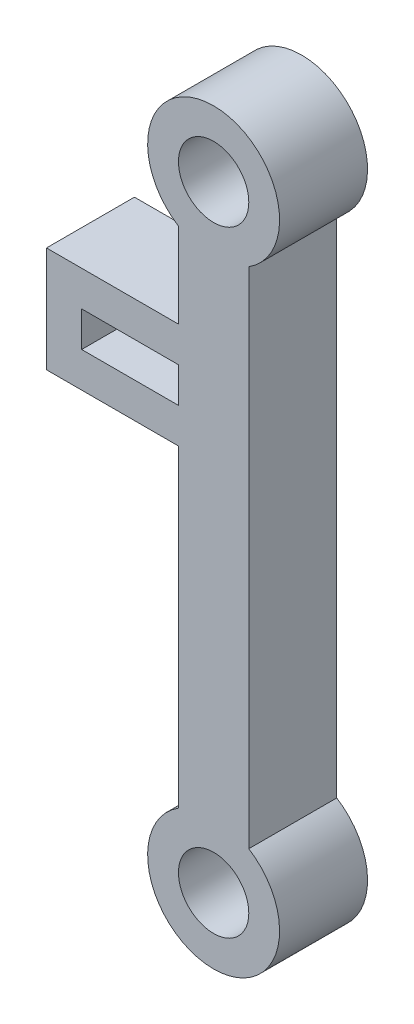
ISO-10303-21;
HEADER;
FILE_DESCRIPTION(('STEP AP214'),'2;1');
FILE_NAME('part.step','',(''),(''),'','','');
FILE_SCHEMA(('AUTOMOTIVE_DESIGN { 1 0 10303 214 1 1 1 1 }'));
ENDSEC;
DATA;
#1=APPLICATION_CONTEXT('core data for automotive mechanical design processes');
#2=APPLICATION_PROTOCOL_DEFINITION('international standard','automotive_design',2000,#1);
#3=PRODUCT_CONTEXT('',#1,'mechanical');
#4=PRODUCT('Part','Part','',(#3));
#5=PRODUCT_RELATED_PRODUCT_CATEGORY('part','',(#4));
#6=PRODUCT_DEFINITION_FORMATION('','',#4);
#7=PRODUCT_DEFINITION_CONTEXT('part definition',#1,'design');
#8=PRODUCT_DEFINITION('design','',#6,#7);
#9=PRODUCT_DEFINITION_SHAPE('','',#8);
#10=(LENGTH_UNIT() NAMED_UNIT(*) SI_UNIT(.MILLI.,.METRE.));
#11=(NAMED_UNIT(*) PLANE_ANGLE_UNIT() SI_UNIT($,.RADIAN.));
#12=(NAMED_UNIT(*) SI_UNIT($,.STERADIAN.) SOLID_ANGLE_UNIT());
#13=UNCERTAINTY_MEASURE_WITH_UNIT(LENGTH_MEASURE(1.E-05),#10,'distance_accuracy_value','');
#14=(GEOMETRIC_REPRESENTATION_CONTEXT(3) GLOBAL_UNCERTAINTY_ASSIGNED_CONTEXT((#13)) GLOBAL_UNIT_ASSIGNED_CONTEXT((#10,
#11,#12)) REPRESENTATION_CONTEXT('',''));
#15=CARTESIAN_POINT('',(0.,0.,0.));
#16=DIRECTION('',(0.,0.,1.));
#17=DIRECTION('',(1.,0.,0.));
#18=AXIS2_PLACEMENT_3D('',#15,#16,#17);
#19=CARTESIAN_POINT('',(0.,70.,10.));
#20=DIRECTION('',(0.,0.,1.));
#21=DIRECTION('',(1.,0.,0.));
#22=AXIS2_PLACEMENT_3D('',#19,#20,#21);
#23=PLANE('',#22);
#24=CARTESIAN_POINT('',(0.,70.,10.));
#25=DIRECTION('',(0.,0.,1.));
#26=DIRECTION('',(1.,0.,0.));
#27=AXIS2_PLACEMENT_3D('',#24,#25,#26);
#28=CIRCLE('',#27,4.00000000000001);
#29=CARTESIAN_POINT('',(4.00000000000001,70.,10.));
#30=VERTEX_POINT('',#29);
#31=EDGE_CURVE('E164',#30,#30,#28,.T.);
#32=ORIENTED_EDGE('',*,*,#31,.F.);
#33=EDGE_LOOP('',(#32));
#34=FACE_BOUND('',#33,.T.);
#35=CARTESIAN_POINT('',(0.,70.,10.));
#36=DIRECTION('',(0.,0.,1.));
#37=DIRECTION('',(1.,0.,0.));
#38=AXIS2_PLACEMENT_3D('',#35,#36,#37);
#39=CIRCLE('',#38,7.5);
#40=CARTESIAN_POINT('',(4.,63.6557112297752,10.));
#41=VERTEX_POINT('',#40);
#42=CARTESIAN_POINT('',(-4.,63.6557112297752,10.));
#43=VERTEX_POINT('',#42);
#44=EDGE_CURVE('E170',#41,#43,#39,.T.);
#45=ORIENTED_EDGE('',*,*,#44,.T.);
#46=DIRECTION('',(0.,-1.,0.));
#47=VECTOR('',#46,1.);
#48=CARTESIAN_POINT('',(-4.,63.6557112297752,10.));
#49=LINE('',#48,#47);
#50=CARTESIAN_POINT('',(-4.,54.,10.));
#51=VERTEX_POINT('',#50);
#52=EDGE_CURVE('E173',#43,#51,#49,.T.);
#53=ORIENTED_EDGE('',*,*,#52,.T.);
#54=DIRECTION('',(-1.,0.,0.));
#55=VECTOR('',#54,1.);
#56=CARTESIAN_POINT('',(-19.,54.,10.));
#57=LINE('',#56,#55);
#58=CARTESIAN_POINT('',(-19.,54.,10.));
#59=VERTEX_POINT('',#58);
#60=EDGE_CURVE('E176',#51,#59,#57,.T.);
#61=ORIENTED_EDGE('',*,*,#60,.T.);
#62=DIRECTION('',(0.,-1.,0.));
#63=VECTOR('',#62,1.);
#64=CARTESIAN_POINT('',(-19.,42.,10.));
#65=LINE('',#64,#63);
#66=CARTESIAN_POINT('',(-19.,42.,10.));
#67=VERTEX_POINT('',#66);
#68=EDGE_CURVE('E178',#59,#67,#65,.T.);
#69=ORIENTED_EDGE('',*,*,#68,.T.);
#70=DIRECTION('',(1.,0.,0.));
#71=VECTOR('',#70,1.);
#72=CARTESIAN_POINT('',(-4.,42.,10.));
#73=LINE('',#72,#71);
#74=CARTESIAN_POINT('',(-4.,42.,10.));
#75=VERTEX_POINT('',#74);
#76=EDGE_CURVE('E180',#67,#75,#73,.T.);
#77=ORIENTED_EDGE('',*,*,#76,.T.);
#78=DIRECTION('',(0.,-1.,0.));
#79=VECTOR('',#78,1.);
#80=CARTESIAN_POINT('',(-4.,42.,10.));
#81=LINE('',#80,#79);
#82=CARTESIAN_POINT('',(-3.99999999999999,6.34428877022475,10.));
#83=VERTEX_POINT('',#82);
#84=EDGE_CURVE('E182',#75,#83,#81,.T.);
#85=ORIENTED_EDGE('',*,*,#84,.T.);
#86=CARTESIAN_POINT('',(0.,0.,10.));
#87=DIRECTION('',(0.,0.,1.));
#88=DIRECTION('',(1.,0.,0.));
#89=AXIS2_PLACEMENT_3D('',#86,#87,#88);
#90=CIRCLE('',#89,7.49999999999999);
#91=CARTESIAN_POINT('',(4.00000000000001,6.34428877022475,10.));
#92=VERTEX_POINT('',#91);
#93=EDGE_CURVE('E184',#83,#92,#90,.T.);
#94=ORIENTED_EDGE('',*,*,#93,.T.);
#95=DIRECTION('',(0.,1.,0.));
#96=VECTOR('',#95,1.);
#97=CARTESIAN_POINT('',(4.,63.6557112297752,10.));
#98=LINE('',#97,#96);
#99=EDGE_CURVE('E186',#92,#41,#98,.T.);
#100=ORIENTED_EDGE('',*,*,#99,.T.);
#101=EDGE_LOOP('',(#45,#53,#61,#69,#77,#85,#94,#100));
#102=FACE_BOUND('',#101,.T.);
#103=CARTESIAN_POINT('',(0.,0.,10.));
#104=DIRECTION('',(0.,0.,1.));
#105=DIRECTION('',(1.,0.,0.));
#106=AXIS2_PLACEMENT_3D('',#103,#104,#105);
#107=CIRCLE('',#106,4.);
#108=CARTESIAN_POINT('',(4.,0.,10.));
#109=VERTEX_POINT('',#108);
#110=EDGE_CURVE('E158',#109,#109,#107,.T.);
#111=ORIENTED_EDGE('',*,*,#110,.F.);
#112=EDGE_LOOP('',(#111));
#113=FACE_BOUND('',#112,.T.);
#114=DIRECTION('',(-1.,0.,0.));
#115=VECTOR('',#114,1.);
#116=CARTESIAN_POINT('',(-15.,50.,10.));
#117=LINE('',#116,#115);
#118=CARTESIAN_POINT('',(-4.00000000000001,50.,10.));
#119=VERTEX_POINT('',#118);
#120=CARTESIAN_POINT('',(-15.,50.,10.));
#121=VERTEX_POINT('',#120);
#122=EDGE_CURVE('E130',#119,#121,#117,.T.);
#123=ORIENTED_EDGE('',*,*,#122,.F.);
#124=DIRECTION('',(0.,1.,0.));
#125=VECTOR('',#124,1.);
#126=CARTESIAN_POINT('',(-4.00000000000001,50.,10.));
#127=LINE('',#126,#125);
#128=CARTESIAN_POINT('',(-4.00000000000001,46.,10.));
#129=VERTEX_POINT('',#128);
#130=EDGE_CURVE('E122',#129,#119,#127,.T.);
#131=ORIENTED_EDGE('',*,*,#130,.F.);
#132=DIRECTION('',(1.,0.,0.));
#133=VECTOR('',#132,1.);
#134=CARTESIAN_POINT('',(-15.,46.,10.));
#135=LINE('',#134,#133);
#136=CARTESIAN_POINT('',(-15.,46.,10.));
#137=VERTEX_POINT('',#136);
#138=EDGE_CURVE('E144',#137,#129,#135,.T.);
#139=ORIENTED_EDGE('',*,*,#138,.F.);
#140=DIRECTION('',(0.,-1.,0.));
#141=VECTOR('',#140,1.);
#142=CARTESIAN_POINT('',(-15.,50.,10.));
#143=LINE('',#142,#141);
#144=EDGE_CURVE('E142',#121,#137,#143,.T.);
#145=ORIENTED_EDGE('',*,*,#144,.F.);
#146=EDGE_LOOP('',(#123,#131,#139,#145));
#147=FACE_BOUND('',#146,.T.);
#148=ADVANCED_FACE('F33',(#34,#102,#113,#147),#23,.T.);
#149=CARTESIAN_POINT('',(0.,70.,0.));
#150=DIRECTION('',(0.,0.,1.));
#151=DIRECTION('',(1.,0.,0.));
#152=AXIS2_PLACEMENT_3D('',#149,#150,#151);
#153=PLANE('',#152);
#154=CARTESIAN_POINT('',(0.,0.,0.));
#155=DIRECTION('',(0.,0.,1.));
#156=DIRECTION('',(1.,0.,0.));
#157=AXIS2_PLACEMENT_3D('',#154,#155,#156);
#158=CIRCLE('',#157,4.);
#159=CARTESIAN_POINT('',(4.,0.,0.));
#160=VERTEX_POINT('',#159);
#161=EDGE_CURVE('E138',#160,#160,#158,.T.);
#162=ORIENTED_EDGE('',*,*,#161,.T.);
#163=EDGE_LOOP('',(#162));
#164=FACE_BOUND('',#163,.T.);
#165=CARTESIAN_POINT('',(0.,70.,0.));
#166=DIRECTION('',(0.,0.,1.));
#167=DIRECTION('',(1.,0.,0.));
#168=AXIS2_PLACEMENT_3D('',#165,#166,#167);
#169=CIRCLE('',#168,4.00000000000001);
#170=CARTESIAN_POINT('',(4.00000000000001,70.,0.));
#171=VERTEX_POINT('',#170);
#172=EDGE_CURVE('E161',#171,#171,#169,.T.);
#173=ORIENTED_EDGE('',*,*,#172,.T.);
#174=EDGE_LOOP('',(#173));
#175=FACE_BOUND('',#174,.T.);
#176=CARTESIAN_POINT('',(0.,70.,0.));
#177=DIRECTION('',(0.,0.,1.));
#178=DIRECTION('',(1.,0.,0.));
#179=AXIS2_PLACEMENT_3D('',#176,#177,#178);
#180=CIRCLE('',#179,7.5);
#181=CARTESIAN_POINT('',(4.,63.6557112297752,0.));
#182=VERTEX_POINT('',#181);
#183=CARTESIAN_POINT('',(-4.,63.6557112297752,0.));
#184=VERTEX_POINT('',#183);
#185=EDGE_CURVE('E167',#182,#184,#180,.T.);
#186=ORIENTED_EDGE('',*,*,#185,.F.);
#187=DIRECTION('',(0.,1.,0.));
#188=VECTOR('',#187,1.);
#189=CARTESIAN_POINT('',(4.,63.6557112297752,0.));
#190=LINE('',#189,#188);
#191=CARTESIAN_POINT('',(4.00000000000001,6.34428877022475,0.));
#192=VERTEX_POINT('',#191);
#193=EDGE_CURVE('E174',#192,#182,#190,.T.);
#194=ORIENTED_EDGE('',*,*,#193,.F.);
#195=CARTESIAN_POINT('',(0.,0.,0.));
#196=DIRECTION('',(0.,0.,1.));
#197=DIRECTION('',(1.,0.,0.));
#198=AXIS2_PLACEMENT_3D('',#195,#196,#197);
#199=CIRCLE('',#198,7.49999999999999);
#200=CARTESIAN_POINT('',(-3.99999999999999,6.34428877022475,0.));
#201=VERTEX_POINT('',#200);
#202=EDGE_CURVE('E201',#201,#192,#199,.T.);
#203=ORIENTED_EDGE('',*,*,#202,.F.);
#204=DIRECTION('',(0.,-1.,0.));
#205=VECTOR('',#204,1.);
#206=CARTESIAN_POINT('',(-4.,42.,0.));
#207=LINE('',#206,#205);
#208=CARTESIAN_POINT('',(-4.,42.,0.));
#209=VERTEX_POINT('',#208);
#210=EDGE_CURVE('E199',#209,#201,#207,.T.);
#211=ORIENTED_EDGE('',*,*,#210,.F.);
#212=DIRECTION('',(1.,0.,0.));
#213=VECTOR('',#212,1.);
#214=CARTESIAN_POINT('',(-4.,42.,0.));
#215=LINE('',#214,#213);
#216=CARTESIAN_POINT('',(-19.,42.,0.));
#217=VERTEX_POINT('',#216);
#218=EDGE_CURVE('E197',#217,#209,#215,.T.);
#219=ORIENTED_EDGE('',*,*,#218,.F.);
#220=DIRECTION('',(0.,-1.,0.));
#221=VECTOR('',#220,1.);
#222=CARTESIAN_POINT('',(-19.,42.,0.));
#223=LINE('',#222,#221);
#224=CARTESIAN_POINT('',(-19.,54.,0.));
#225=VERTEX_POINT('',#224);
#226=EDGE_CURVE('E195',#225,#217,#223,.T.);
#227=ORIENTED_EDGE('',*,*,#226,.F.);
#228=DIRECTION('',(-1.,0.,0.));
#229=VECTOR('',#228,1.);
#230=CARTESIAN_POINT('',(-19.,54.,0.));
#231=LINE('',#230,#229);
#232=CARTESIAN_POINT('',(-4.,54.,0.));
#233=VERTEX_POINT('',#232);
#234=EDGE_CURVE('E193',#233,#225,#231,.T.);
#235=ORIENTED_EDGE('',*,*,#234,.F.);
#236=DIRECTION('',(0.,-1.,0.));
#237=VECTOR('',#236,1.);
#238=CARTESIAN_POINT('',(-4.,63.6557112297752,0.));
#239=LINE('',#238,#237);
#240=EDGE_CURVE('E191',#184,#233,#239,.T.);
#241=ORIENTED_EDGE('',*,*,#240,.F.);
#242=EDGE_LOOP('',(#186,#194,#203,#211,#219,#227,#235,#241));
#243=FACE_BOUND('',#242,.T.);
#244=DIRECTION('',(0.,1.,0.));
#245=VECTOR('',#244,1.);
#246=CARTESIAN_POINT('',(-4.00000000000001,50.,0.));
#247=LINE('',#246,#245);
#248=CARTESIAN_POINT('',(-4.00000000000001,46.,0.));
#249=VERTEX_POINT('',#248);
#250=CARTESIAN_POINT('',(-4.00000000000001,50.,0.));
#251=VERTEX_POINT('',#250);
#252=EDGE_CURVE('E56',#249,#251,#247,.T.);
#253=ORIENTED_EDGE('',*,*,#252,.T.);
#254=DIRECTION('',(-1.,0.,0.));
#255=VECTOR('',#254,1.);
#256=CARTESIAN_POINT('',(-15.,50.,0.));
#257=LINE('',#256,#255);
#258=CARTESIAN_POINT('',(-15.,50.,0.));
#259=VERTEX_POINT('',#258);
#260=EDGE_CURVE('E137',#251,#259,#257,.T.);
#261=ORIENTED_EDGE('',*,*,#260,.T.);
#262=DIRECTION('',(0.,-1.,0.));
#263=VECTOR('',#262,1.);
#264=CARTESIAN_POINT('',(-15.,50.,0.));
#265=LINE('',#264,#263);
#266=CARTESIAN_POINT('',(-15.,46.,0.));
#267=VERTEX_POINT('',#266);
#268=EDGE_CURVE('E150',#259,#267,#265,.T.);
#269=ORIENTED_EDGE('',*,*,#268,.T.);
#270=DIRECTION('',(1.,0.,0.));
#271=VECTOR('',#270,1.);
#272=CARTESIAN_POINT('',(-15.,46.,0.));
#273=LINE('',#272,#271);
#274=EDGE_CURVE('E131',#267,#249,#273,.T.);
#275=ORIENTED_EDGE('',*,*,#274,.T.);
#276=EDGE_LOOP('',(#253,#261,#269,#275));
#277=FACE_BOUND('',#276,.T.);
#278=ADVANCED_FACE('F231',(#164,#175,#243,#277),#153,.F.);
#279=CARTESIAN_POINT('',(0.,70.,10.));
#280=DIRECTION('',(0.,0.,-1.));
#281=DIRECTION('',(-1.,0.,0.));
#282=AXIS2_PLACEMENT_3D('',#279,#280,#281);
#283=CYLINDRICAL_SURFACE('',#282,7.5);
#284=ORIENTED_EDGE('',*,*,#185,.T.);
#285=DIRECTION('',(0.,0.,-1.));
#286=VECTOR('',#285,1.);
#287=CARTESIAN_POINT('',(-4.,63.6557112297752,10.));
#288=LINE('',#287,#286);
#289=EDGE_CURVE('E11',#43,#184,#288,.T.);
#290=ORIENTED_EDGE('',*,*,#289,.F.);
#291=ORIENTED_EDGE('',*,*,#44,.F.);
#292=DIRECTION('',(0.,0.,-1.));
#293=VECTOR('',#292,1.);
#294=CARTESIAN_POINT('',(4.,63.6557112297752,10.));
#295=LINE('',#294,#293);
#296=EDGE_CURVE('E188',#41,#182,#295,.T.);
#297=ORIENTED_EDGE('',*,*,#296,.T.);
#298=EDGE_LOOP('',(#284,#290,#291,#297));
#299=FACE_BOUND('',#298,.T.);
#300=ADVANCED_FACE('F35',(#299),#283,.T.);
#301=CARTESIAN_POINT('',(-4.,63.6557112297752,10.));
#302=DIRECTION('',(1.,0.,0.));
#303=DIRECTION('',(0.,1.,0.));
#304=AXIS2_PLACEMENT_3D('',#301,#302,#303);
#305=PLANE('',#304);
#306=ORIENTED_EDGE('',*,*,#240,.T.);
#307=DIRECTION('',(0.,0.,-1.));
#308=VECTOR('',#307,1.);
#309=CARTESIAN_POINT('',(-4.,54.,10.));
#310=LINE('',#309,#308);
#311=EDGE_CURVE('E41',#51,#233,#310,.T.);
#312=ORIENTED_EDGE('',*,*,#311,.F.);
#313=ORIENTED_EDGE('',*,*,#52,.F.);
#314=ORIENTED_EDGE('',*,*,#289,.T.);
#315=EDGE_LOOP('',(#306,#312,#313,#314));
#316=FACE_BOUND('',#315,.T.);
#317=ADVANCED_FACE('F249',(#316),#305,.F.);
#318=CARTESIAN_POINT('',(-19.,54.,10.));
#319=DIRECTION('',(0.,-1.,0.));
#320=DIRECTION('',(1.,0.,0.));
#321=AXIS2_PLACEMENT_3D('',#318,#319,#320);
#322=PLANE('',#321);
#323=ORIENTED_EDGE('',*,*,#234,.T.);
#324=DIRECTION('',(0.,0.,-1.));
#325=VECTOR('',#324,1.);
#326=CARTESIAN_POINT('',(-19.,54.,10.));
#327=LINE('',#326,#325);
#328=EDGE_CURVE('E218',#59,#225,#327,.T.);
#329=ORIENTED_EDGE('',*,*,#328,.F.);
#330=ORIENTED_EDGE('',*,*,#60,.F.);
#331=ORIENTED_EDGE('',*,*,#311,.T.);
#332=EDGE_LOOP('',(#323,#329,#330,#331));
#333=FACE_BOUND('',#332,.T.);
#334=ADVANCED_FACE('F225',(#333),#322,.F.);
#335=CARTESIAN_POINT('',(-19.,42.,10.));
#336=DIRECTION('',(1.,0.,0.));
#337=DIRECTION('',(0.,1.,0.));
#338=AXIS2_PLACEMENT_3D('',#335,#336,#337);
#339=PLANE('',#338);
#340=ORIENTED_EDGE('',*,*,#226,.T.);
#341=DIRECTION('',(0.,0.,-1.));
#342=VECTOR('',#341,1.);
#343=CARTESIAN_POINT('',(-19.,42.,10.));
#344=LINE('',#343,#342);
#345=EDGE_CURVE('E215',#67,#217,#344,.T.);
#346=ORIENTED_EDGE('',*,*,#345,.F.);
#347=ORIENTED_EDGE('',*,*,#68,.F.);
#348=ORIENTED_EDGE('',*,*,#328,.T.);
#349=EDGE_LOOP('',(#340,#346,#347,#348));
#350=FACE_BOUND('',#349,.T.);
#351=ADVANCED_FACE('F237',(#350),#339,.F.);
#352=CARTESIAN_POINT('',(-4.,42.,10.));
#353=DIRECTION('',(0.,1.,0.));
#354=DIRECTION('',(-1.,0.,0.));
#355=AXIS2_PLACEMENT_3D('',#352,#353,#354);
#356=PLANE('',#355);
#357=ORIENTED_EDGE('',*,*,#218,.T.);
#358=DIRECTION('',(0.,0.,-1.));
#359=VECTOR('',#358,1.);
#360=CARTESIAN_POINT('',(-4.,42.,10.));
#361=LINE('',#360,#359);
#362=EDGE_CURVE('E212',#75,#209,#361,.T.);
#363=ORIENTED_EDGE('',*,*,#362,.F.);
#364=ORIENTED_EDGE('',*,*,#76,.F.);
#365=ORIENTED_EDGE('',*,*,#345,.T.);
#366=EDGE_LOOP('',(#357,#363,#364,#365));
#367=FACE_BOUND('',#366,.T.);
#368=ADVANCED_FACE('F241',(#367),#356,.F.);
#369=CARTESIAN_POINT('',(-4.,42.,10.));
#370=DIRECTION('',(1.,0.,0.));
#371=DIRECTION('',(0.,1.,0.));
#372=AXIS2_PLACEMENT_3D('',#369,#370,#371);
#373=PLANE('',#372);
#374=ORIENTED_EDGE('',*,*,#210,.T.);
#375=DIRECTION('',(0.,0.,-1.));
#376=VECTOR('',#375,1.);
#377=CARTESIAN_POINT('',(-3.99999999999999,6.34428877022475,10.));
#378=LINE('',#377,#376);
#379=EDGE_CURVE('E209',#83,#201,#378,.T.);
#380=ORIENTED_EDGE('',*,*,#379,.F.);
#381=ORIENTED_EDGE('',*,*,#84,.F.);
#382=ORIENTED_EDGE('',*,*,#362,.T.);
#383=EDGE_LOOP('',(#374,#380,#381,#382));
#384=FACE_BOUND('',#383,.T.);
#385=ADVANCED_FACE('F262',(#384),#373,.F.);
#386=CARTESIAN_POINT('',(0.,0.,10.));
#387=DIRECTION('',(0.,0.,-1.));
#388=DIRECTION('',(-1.,0.,0.));
#389=AXIS2_PLACEMENT_3D('',#386,#387,#388);
#390=CYLINDRICAL_SURFACE('',#389,7.49999999999999);
#391=ORIENTED_EDGE('',*,*,#202,.T.);
#392=DIRECTION('',(0.,0.,-1.));
#393=VECTOR('',#392,1.);
#394=CARTESIAN_POINT('',(4.00000000000001,6.34428877022475,10.));
#395=LINE('',#394,#393);
#396=EDGE_CURVE('E206',#92,#192,#395,.T.);
#397=ORIENTED_EDGE('',*,*,#396,.F.);
#398=ORIENTED_EDGE('',*,*,#93,.F.);
#399=ORIENTED_EDGE('',*,*,#379,.T.);
#400=EDGE_LOOP('',(#391,#397,#398,#399));
#401=FACE_BOUND('',#400,.T.);
#402=ADVANCED_FACE('F260',(#401),#390,.T.);
#403=CARTESIAN_POINT('',(4.,63.6557112297752,10.));
#404=DIRECTION('',(-1.,0.,0.));
#405=DIRECTION('',(0.,-1.,0.));
#406=AXIS2_PLACEMENT_3D('',#403,#404,#405);
#407=PLANE('',#406);
#408=ORIENTED_EDGE('',*,*,#193,.T.);
#409=ORIENTED_EDGE('',*,*,#296,.F.);
#410=ORIENTED_EDGE('',*,*,#99,.F.);
#411=ORIENTED_EDGE('',*,*,#396,.T.);
#412=EDGE_LOOP('',(#408,#409,#410,#411));
#413=FACE_BOUND('',#412,.T.);
#414=ADVANCED_FACE('F255',(#413),#407,.F.);
#415=CARTESIAN_POINT('',(0.,70.,10.));
#416=DIRECTION('',(0.,0.,-1.));
#417=DIRECTION('',(-1.,0.,0.));
#418=AXIS2_PLACEMENT_3D('',#415,#416,#417);
#419=CYLINDRICAL_SURFACE('',#418,4.00000000000001);
#420=ORIENTED_EDGE('',*,*,#31,.T.);
#421=EDGE_LOOP('',(#420));
#422=FACE_BOUND('',#421,.T.);
#423=ORIENTED_EDGE('',*,*,#172,.F.);
#424=EDGE_LOOP('',(#423));
#425=FACE_BOUND('',#424,.T.);
#426=ADVANCED_FACE('F281',(#422,#425),#419,.F.);
#427=CARTESIAN_POINT('',(0.,0.,10.));
#428=DIRECTION('',(0.,0.,-1.));
#429=DIRECTION('',(-1.,0.,0.));
#430=AXIS2_PLACEMENT_3D('',#427,#428,#429);
#431=CYLINDRICAL_SURFACE('',#430,4.);
#432=ORIENTED_EDGE('',*,*,#110,.T.);
#433=EDGE_LOOP('',(#432));
#434=FACE_BOUND('',#433,.T.);
#435=ORIENTED_EDGE('',*,*,#161,.F.);
#436=EDGE_LOOP('',(#435));
#437=FACE_BOUND('',#436,.T.);
#438=ADVANCED_FACE('F288',(#434,#437),#431,.F.);
#439=CARTESIAN_POINT('',(-4.00000000000001,50.,10.));
#440=DIRECTION('',(-1.,0.,0.));
#441=DIRECTION('',(0.,0.,1.));
#442=AXIS2_PLACEMENT_3D('',#439,#440,#441);
#443=PLANE('',#442);
#444=ORIENTED_EDGE('',*,*,#252,.F.);
#445=DIRECTION('',(0.,0.,-1.));
#446=VECTOR('',#445,1.);
#447=CARTESIAN_POINT('',(-4.00000000000001,46.,10.));
#448=LINE('',#447,#446);
#449=EDGE_CURVE('E126',#129,#249,#448,.T.);
#450=ORIENTED_EDGE('',*,*,#449,.F.);
#451=ORIENTED_EDGE('',*,*,#130,.T.);
#452=DIRECTION('',(0.,0.,-1.));
#453=VECTOR('',#452,1.);
#454=CARTESIAN_POINT('',(-4.00000000000001,50.,10.));
#455=LINE('',#454,#453);
#456=EDGE_CURVE('E125',#119,#251,#455,.T.);
#457=ORIENTED_EDGE('',*,*,#456,.T.);
#458=EDGE_LOOP('',(#444,#450,#451,#457));
#459=FACE_BOUND('',#458,.T.);
#460=ADVANCED_FACE('F124',(#459),#443,.T.);
#461=CARTESIAN_POINT('',(-15.,50.,10.));
#462=DIRECTION('',(0.,-1.,0.));
#463=DIRECTION('',(0.,0.,-1.));
#464=AXIS2_PLACEMENT_3D('',#461,#462,#463);
#465=PLANE('',#464);
#466=ORIENTED_EDGE('',*,*,#260,.F.);
#467=ORIENTED_EDGE('',*,*,#456,.F.);
#468=ORIENTED_EDGE('',*,*,#122,.T.);
#469=DIRECTION('',(0.,0.,-1.));
#470=VECTOR('',#469,1.);
#471=CARTESIAN_POINT('',(-15.,50.,10.));
#472=LINE('',#471,#470);
#473=EDGE_CURVE('E139',#121,#259,#472,.T.);
#474=ORIENTED_EDGE('',*,*,#473,.T.);
#475=EDGE_LOOP('',(#466,#467,#468,#474));
#476=FACE_BOUND('',#475,.T.);
#477=ADVANCED_FACE('F134',(#476),#465,.T.);
#478=CARTESIAN_POINT('',(-15.,50.,10.));
#479=DIRECTION('',(1.,0.,0.));
#480=DIRECTION('',(0.,0.,-1.));
#481=AXIS2_PLACEMENT_3D('',#478,#479,#480);
#482=PLANE('',#481);
#483=ORIENTED_EDGE('',*,*,#268,.F.);
#484=ORIENTED_EDGE('',*,*,#473,.F.);
#485=ORIENTED_EDGE('',*,*,#144,.T.);
#486=DIRECTION('',(0.,0.,-1.));
#487=VECTOR('',#486,1.);
#488=CARTESIAN_POINT('',(-15.,46.,10.));
#489=LINE('',#488,#487);
#490=EDGE_CURVE('E48',#137,#267,#489,.T.);
#491=ORIENTED_EDGE('',*,*,#490,.T.);
#492=EDGE_LOOP('',(#483,#484,#485,#491));
#493=FACE_BOUND('',#492,.T.);
#494=ADVANCED_FACE('F305',(#493),#482,.T.);
#495=CARTESIAN_POINT('',(-15.,46.,10.));
#496=DIRECTION('',(0.,1.,0.));
#497=DIRECTION('',(0.,0.,1.));
#498=AXIS2_PLACEMENT_3D('',#495,#496,#497);
#499=PLANE('',#498);
#500=ORIENTED_EDGE('',*,*,#274,.F.);
#501=ORIENTED_EDGE('',*,*,#490,.F.);
#502=ORIENTED_EDGE('',*,*,#138,.T.);
#503=ORIENTED_EDGE('',*,*,#449,.T.);
#504=EDGE_LOOP('',(#500,#501,#502,#503));
#505=FACE_BOUND('',#504,.T.);
#506=ADVANCED_FACE('F308',(#505),#499,.T.);
#507=CLOSED_SHELL('',(#148,#278,#300,#317,#334,#351,#368,#385,#402,#414,#426,#438,#460,#477,
#494,#506));
#508=MANIFOLD_SOLID_BREP('B2',#507);
#509=ADVANCED_BREP_SHAPE_REPRESENTATION('',(#18,#508),#14);
#510=SHAPE_DEFINITION_REPRESENTATION(#9,#509);
ENDSEC;
END-ISO-10303-21;
